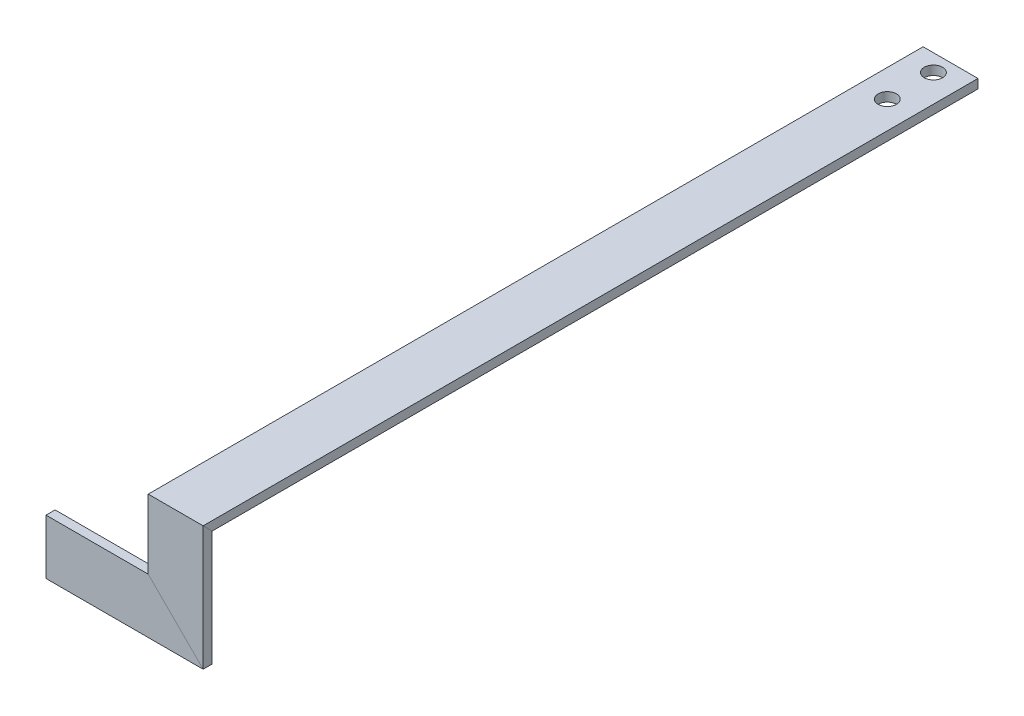
ISO-10303-21;
HEADER;
FILE_DESCRIPTION(('STEP AP214'),'2;1');
FILE_NAME('part.step','',(''),(''),'','','');
FILE_SCHEMA(('AUTOMOTIVE_DESIGN { 1 0 10303 214 1 1 1 1 }'));
ENDSEC;
DATA;
#1=APPLICATION_CONTEXT('core data for automotive mechanical design processes');
#2=APPLICATION_PROTOCOL_DEFINITION('international standard','automotive_design',2000,#1);
#3=PRODUCT_CONTEXT('',#1,'mechanical');
#4=PRODUCT('Part','Part','',(#3));
#5=PRODUCT_RELATED_PRODUCT_CATEGORY('part','',(#4));
#6=PRODUCT_DEFINITION_FORMATION('','',#4);
#7=PRODUCT_DEFINITION_CONTEXT('part definition',#1,'design');
#8=PRODUCT_DEFINITION('design','',#6,#7);
#9=PRODUCT_DEFINITION_SHAPE('','',#8);
#10=(LENGTH_UNIT() NAMED_UNIT(*) SI_UNIT(.MILLI.,.METRE.));
#11=(NAMED_UNIT(*) PLANE_ANGLE_UNIT() SI_UNIT($,.RADIAN.));
#12=(NAMED_UNIT(*) SI_UNIT($,.STERADIAN.) SOLID_ANGLE_UNIT());
#13=UNCERTAINTY_MEASURE_WITH_UNIT(LENGTH_MEASURE(1.E-05),#10,'distance_accuracy_value','');
#14=(GEOMETRIC_REPRESENTATION_CONTEXT(3) GLOBAL_UNCERTAINTY_ASSIGNED_CONTEXT((#13)) GLOBAL_UNIT_ASSIGNED_CONTEXT((#10,
#11,#12)) REPRESENTATION_CONTEXT('',''));
#15=CARTESIAN_POINT('',(0.,0.,0.));
#16=DIRECTION('',(0.,0.,1.));
#17=DIRECTION('',(1.,0.,0.));
#18=AXIS2_PLACEMENT_3D('',#15,#16,#17);
#19=CARTESIAN_POINT('',(-90.,-64.,534.55));
#20=DIRECTION('',(-1.,0.,0.));
#21=DIRECTION('',(0.,-1.,0.));
#22=AXIS2_PLACEMENT_3D('',#19,#20,#21);
#23=PLANE('',#22);
#24=DIRECTION('',(0.,0.,1.));
#25=VECTOR('',#24,1.);
#26=CARTESIAN_POINT('',(-90.,-83.05,537.705));
#27=LINE('',#26,#25);
#28=CARTESIAN_POINT('',(-90.,-83.05,531.395));
#29=VERTEX_POINT('',#28);
#30=CARTESIAN_POINT('',(-90.,-83.05,537.705));
#31=VERTEX_POINT('',#30);
#32=EDGE_CURVE('E86',#29,#31,#27,.T.);
#33=ORIENTED_EDGE('',*,*,#32,.T.);
#34=DIRECTION('',(0.,1.,0.));
#35=VECTOR('',#34,1.);
#36=CARTESIAN_POINT('',(-90.,-44.95,537.705));
#37=LINE('',#36,#35);
#38=CARTESIAN_POINT('',(-90.,-44.95,537.705));
#39=VERTEX_POINT('',#38);
#40=EDGE_CURVE('E84',#31,#39,#37,.T.);
#41=ORIENTED_EDGE('',*,*,#40,.T.);
#42=DIRECTION('',(0.,0.,-1.));
#43=VECTOR('',#42,1.);
#44=CARTESIAN_POINT('',(-90.,-44.95,537.705));
#45=LINE('',#44,#43);
#46=CARTESIAN_POINT('',(-90.,-44.95,531.395));
#47=VERTEX_POINT('',#46);
#48=EDGE_CURVE('E81',#39,#47,#45,.T.);
#49=ORIENTED_EDGE('',*,*,#48,.T.);
#50=DIRECTION('',(0.,-1.,0.));
#51=VECTOR('',#50,1.);
#52=CARTESIAN_POINT('',(-90.,-44.95,531.395));
#53=LINE('',#52,#51);
#54=EDGE_CURVE('E101',#47,#29,#53,.T.);
#55=ORIENTED_EDGE('',*,*,#54,.T.);
#56=EDGE_LOOP('',(#33,#41,#49,#55));
#57=FACE_BOUND('',#56,.T.);
#58=ADVANCED_FACE('F35',(#57),#23,.T.);
#59=CARTESIAN_POINT('',(0.,0.,0.));
#60=DIRECTION('',(0.,0.,1.));
#61=DIRECTION('',(1.,0.,0.));
#62=AXIS2_PLACEMENT_3D('',#59,#60,#61);
#63=PLANE('',#62);
#64=DIRECTION('',(0.,1.,0.));
#65=VECTOR('',#64,1.);
#66=CARTESIAN_POINT('',(19.05,3.155,0.));
#67=LINE('',#66,#65);
#68=CARTESIAN_POINT('',(19.05,-3.155,0.));
#69=VERTEX_POINT('',#68);
#70=CARTESIAN_POINT('',(19.05,3.155,0.));
#71=VERTEX_POINT('',#70);
#72=EDGE_CURVE('E143',#69,#71,#67,.T.);
#73=ORIENTED_EDGE('',*,*,#72,.F.);
#74=DIRECTION('',(1.,0.,0.));
#75=VECTOR('',#74,1.);
#76=CARTESIAN_POINT('',(-19.05,-3.155,0.));
#77=LINE('',#76,#75);
#78=CARTESIAN_POINT('',(-19.05,-3.155,0.));
#79=VERTEX_POINT('',#78);
#80=EDGE_CURVE('E149',#79,#69,#77,.T.);
#81=ORIENTED_EDGE('',*,*,#80,.F.);
#82=DIRECTION('',(0.,-1.,0.));
#83=VECTOR('',#82,1.);
#84=CARTESIAN_POINT('',(-19.05,3.155,0.));
#85=LINE('',#84,#83);
#86=CARTESIAN_POINT('',(-19.05,3.155,0.));
#87=VERTEX_POINT('',#86);
#88=EDGE_CURVE('E133',#87,#79,#85,.T.);
#89=ORIENTED_EDGE('',*,*,#88,.F.);
#90=DIRECTION('',(-1.,0.,0.));
#91=VECTOR('',#90,1.);
#92=CARTESIAN_POINT('',(-19.05,3.155,0.));
#93=LINE('',#92,#91);
#94=EDGE_CURVE('E139',#71,#87,#93,.T.);
#95=ORIENTED_EDGE('',*,*,#94,.F.);
#96=EDGE_LOOP('',(#73,#81,#89,#95));
#97=FACE_BOUND('',#96,.T.);
#98=ADVANCED_FACE('F336',(#97),#63,.F.);
#99=CARTESIAN_POINT('',(21.055,-44.95,537.705));
#100=DIRECTION('',(0.,1.,0.));
#101=DIRECTION('',(0.,0.,1.));
#102=AXIS2_PLACEMENT_3D('',#99,#100,#101);
#103=PLANE('',#102);
#104=DIRECTION('',(0.,0.,1.));
#105=VECTOR('',#104,1.);
#106=CARTESIAN_POINT('',(-19.05,-44.95,537.705));
#107=LINE('',#106,#105);
#108=CARTESIAN_POINT('',(-19.05,-44.95,531.395));
#109=VERTEX_POINT('',#108);
#110=CARTESIAN_POINT('',(-19.05,-44.95,537.705));
#111=VERTEX_POINT('',#110);
#112=EDGE_CURVE('E117',#109,#111,#107,.T.);
#113=ORIENTED_EDGE('',*,*,#112,.F.);
#114=DIRECTION('',(-1.,0.,0.));
#115=VECTOR('',#114,1.);
#116=CARTESIAN_POINT('',(21.055,-44.95,531.395));
#117=LINE('',#116,#115);
#118=EDGE_CURVE('E99',#109,#47,#117,.T.);
#119=ORIENTED_EDGE('',*,*,#118,.T.);
#120=ORIENTED_EDGE('',*,*,#48,.F.);
#121=DIRECTION('',(-1.,0.,0.));
#122=VECTOR('',#121,1.);
#123=CARTESIAN_POINT('',(21.055,-44.95,537.705));
#124=LINE('',#123,#122);
#125=EDGE_CURVE('E38',#111,#39,#124,.T.);
#126=ORIENTED_EDGE('',*,*,#125,.F.);
#127=EDGE_LOOP('',(#113,#119,#120,#126));
#128=FACE_BOUND('',#127,.T.);
#129=ADVANCED_FACE('F96',(#128),#103,.T.);
#130=CARTESIAN_POINT('',(21.055,-44.95,531.395));
#131=DIRECTION('',(0.,0.,-1.));
#132=DIRECTION('',(-1.,0.,0.));
#133=AXIS2_PLACEMENT_3D('',#130,#131,#132);
#134=PLANE('',#133);
#135=DIRECTION('',(-0.707106781186548,0.707106781186548,0.));
#136=VECTOR('',#135,1.);
#137=CARTESIAN_POINT('',(-43.3102499999999,-20.68975,531.395));
#138=LINE('',#137,#136);
#139=CARTESIAN_POINT('',(19.05,-83.05,531.395));
#140=VERTEX_POINT('',#139);
#141=EDGE_CURVE('E130',#140,#109,#138,.T.);
#142=ORIENTED_EDGE('',*,*,#141,.F.);
#143=DIRECTION('',(-1.,0.,0.));
#144=VECTOR('',#143,1.);
#145=CARTESIAN_POINT('',(21.055,-83.05,531.395));
#146=LINE('',#145,#144);
#147=EDGE_CURVE('E110',#140,#29,#146,.T.);
#148=ORIENTED_EDGE('',*,*,#147,.T.);
#149=ORIENTED_EDGE('',*,*,#54,.F.);
#150=ORIENTED_EDGE('',*,*,#118,.F.);
#151=EDGE_LOOP('',(#142,#148,#149,#150));
#152=FACE_BOUND('',#151,.T.);
#153=ADVANCED_FACE('F319',(#152),#134,.T.);
#154=CARTESIAN_POINT('',(21.055,-83.05,537.705));
#155=DIRECTION('',(0.,-1.,0.));
#156=DIRECTION('',(0.,0.,-1.));
#157=AXIS2_PLACEMENT_3D('',#154,#155,#156);
#158=PLANE('',#157);
#159=DIRECTION('',(0.,0.,-1.));
#160=VECTOR('',#159,1.);
#161=CARTESIAN_POINT('',(19.05,-83.05,537.705));
#162=LINE('',#161,#160);
#163=CARTESIAN_POINT('',(19.05,-83.05,537.705));
#164=VERTEX_POINT('',#163);
#165=EDGE_CURVE('E127',#164,#140,#162,.T.);
#166=ORIENTED_EDGE('',*,*,#165,.F.);
#167=DIRECTION('',(-1.,0.,0.));
#168=VECTOR('',#167,1.);
#169=CARTESIAN_POINT('',(21.055,-83.05,537.705));
#170=LINE('',#169,#168);
#171=EDGE_CURVE('E100',#164,#31,#170,.T.);
#172=ORIENTED_EDGE('',*,*,#171,.T.);
#173=ORIENTED_EDGE('',*,*,#32,.F.);
#174=ORIENTED_EDGE('',*,*,#147,.F.);
#175=EDGE_LOOP('',(#166,#172,#173,#174));
#176=FACE_BOUND('',#175,.T.);
#177=ADVANCED_FACE('F234',(#176),#158,.T.);
#178=CARTESIAN_POINT('',(21.055,-44.95,537.705));
#179=DIRECTION('',(0.,0.,1.));
#180=DIRECTION('',(1.,0.,0.));
#181=AXIS2_PLACEMENT_3D('',#178,#179,#180);
#182=PLANE('',#181);
#183=DIRECTION('',(0.707106781186548,-0.707106781186548,0.));
#184=VECTOR('',#183,1.);
#185=CARTESIAN_POINT('',(-43.3102499999999,-20.68975,537.705));
#186=LINE('',#185,#184);
#187=EDGE_CURVE('E105',#111,#164,#186,.T.);
#188=ORIENTED_EDGE('',*,*,#187,.F.);
#189=ORIENTED_EDGE('',*,*,#125,.T.);
#190=ORIENTED_EDGE('',*,*,#40,.F.);
#191=ORIENTED_EDGE('',*,*,#171,.F.);
#192=EDGE_LOOP('',(#188,#189,#190,#191));
#193=FACE_BOUND('',#192,.T.);
#194=ADVANCED_FACE('F103',(#193),#182,.T.);
#195=CARTESIAN_POINT('',(-19.05,3.5704999999999,537.705));
#196=DIRECTION('',(0.,0.,1.));
#197=DIRECTION('',(1.,0.,0.));
#198=AXIS2_PLACEMENT_3D('',#195,#196,#197);
#199=PLANE('',#198);
#200=DIRECTION('',(0.,-1.,0.));
#201=VECTOR('',#200,1.);
#202=CARTESIAN_POINT('',(-19.05,3.5704999999999,537.705));
#203=LINE('',#202,#201);
#204=CARTESIAN_POINT('',(-19.05,3.15499999999998,537.705));
#205=VERTEX_POINT('',#204);
#206=EDGE_CURVE('E119',#205,#111,#203,.T.);
#207=ORIENTED_EDGE('',*,*,#206,.T.);
#208=ORIENTED_EDGE('',*,*,#187,.T.);
#209=DIRECTION('',(0.,-1.,0.));
#210=VECTOR('',#209,1.);
#211=CARTESIAN_POINT('',(19.05,3.5704999999999,537.705));
#212=LINE('',#211,#210);
#213=CARTESIAN_POINT('',(19.05,3.15499999999998,537.705));
#214=VERTEX_POINT('',#213);
#215=EDGE_CURVE('E106',#214,#164,#212,.T.);
#216=ORIENTED_EDGE('',*,*,#215,.F.);
#217=DIRECTION('',(1.,0.,0.));
#218=VECTOR('',#217,1.);
#219=CARTESIAN_POINT('',(-19.05,3.155,537.705));
#220=LINE('',#219,#218);
#221=EDGE_CURVE('E137',#205,#214,#220,.T.);
#222=ORIENTED_EDGE('',*,*,#221,.F.);
#223=EDGE_LOOP('',(#207,#208,#216,#222));
#224=FACE_BOUND('',#223,.T.);
#225=ADVANCED_FACE('F226',(#224),#199,.T.);
#226=CARTESIAN_POINT('',(19.05,3.5704999999999,537.705));
#227=DIRECTION('',(1.,0.,0.));
#228=DIRECTION('',(0.,0.,-1.));
#229=AXIS2_PLACEMENT_3D('',#226,#227,#228);
#230=PLANE('',#229);
#231=ORIENTED_EDGE('',*,*,#215,.T.);
#232=ORIENTED_EDGE('',*,*,#165,.T.);
#233=DIRECTION('',(0.,-1.,0.));
#234=VECTOR('',#233,1.);
#235=CARTESIAN_POINT('',(19.05,3.5704999999999,531.395));
#236=LINE('',#235,#234);
#237=CARTESIAN_POINT('',(19.05,-3.15500000000006,531.395));
#238=VERTEX_POINT('',#237);
#239=EDGE_CURVE('E108',#238,#140,#236,.T.);
#240=ORIENTED_EDGE('',*,*,#239,.F.);
#241=DIRECTION('',(0.,-0.707106781186548,-0.707106781186548));
#242=VECTOR('',#241,1.);
#243=CARTESIAN_POINT('',(19.05,-265.6975,268.8525));
#244=LINE('',#243,#242);
#245=EDGE_CURVE('E44',#214,#238,#244,.T.);
#246=ORIENTED_EDGE('',*,*,#245,.F.);
#247=EDGE_LOOP('',(#231,#232,#240,#246));
#248=FACE_BOUND('',#247,.T.);
#249=ADVANCED_FACE('F224',(#248),#230,.T.);
#250=CARTESIAN_POINT('',(-19.05,3.5704999999999,531.395));
#251=DIRECTION('',(0.,0.,-1.));
#252=DIRECTION('',(-1.,0.,0.));
#253=AXIS2_PLACEMENT_3D('',#250,#251,#252);
#254=PLANE('',#253);
#255=ORIENTED_EDGE('',*,*,#239,.T.);
#256=ORIENTED_EDGE('',*,*,#141,.T.);
#257=DIRECTION('',(0.,-1.,0.));
#258=VECTOR('',#257,1.);
#259=CARTESIAN_POINT('',(-19.05,3.5704999999999,531.395));
#260=LINE('',#259,#258);
#261=CARTESIAN_POINT('',(-19.05,-3.15500000000006,531.395));
#262=VERTEX_POINT('',#261);
#263=EDGE_CURVE('E122',#262,#109,#260,.T.);
#264=ORIENTED_EDGE('',*,*,#263,.F.);
#265=DIRECTION('',(-1.,0.,0.));
#266=VECTOR('',#265,1.);
#267=CARTESIAN_POINT('',(-19.05,-3.155,531.395));
#268=LINE('',#267,#266);
#269=EDGE_CURVE('E11',#238,#262,#268,.T.);
#270=ORIENTED_EDGE('',*,*,#269,.F.);
#271=EDGE_LOOP('',(#255,#256,#264,#270));
#272=FACE_BOUND('',#271,.T.);
#273=ADVANCED_FACE('F218',(#272),#254,.T.);
#274=CARTESIAN_POINT('',(-19.05,3.5704999999999,537.705));
#275=DIRECTION('',(-1.,0.,0.));
#276=DIRECTION('',(0.,0.,1.));
#277=AXIS2_PLACEMENT_3D('',#274,#275,#276);
#278=PLANE('',#277);
#279=ORIENTED_EDGE('',*,*,#263,.T.);
#280=ORIENTED_EDGE('',*,*,#112,.T.);
#281=ORIENTED_EDGE('',*,*,#206,.F.);
#282=DIRECTION('',(0.,0.707106781186548,0.707106781186548));
#283=VECTOR('',#282,1.);
#284=CARTESIAN_POINT('',(-19.05,-265.6975,268.8525));
#285=LINE('',#284,#283);
#286=EDGE_CURVE('E134',#262,#205,#285,.T.);
#287=ORIENTED_EDGE('',*,*,#286,.F.);
#288=EDGE_LOOP('',(#279,#280,#281,#287));
#289=FACE_BOUND('',#288,.T.);
#290=ADVANCED_FACE('F191',(#289),#278,.T.);
#291=CARTESIAN_POINT('',(-19.05,3.155,0.));
#292=DIRECTION('',(0.,1.,0.));
#293=DIRECTION('',(0.,0.,1.));
#294=AXIS2_PLACEMENT_3D('',#291,#292,#293);
#295=PLANE('',#294);
#296=CARTESIAN_POINT('',(6.7168492989822E-12,3.155,11.892204665723));
#297=DIRECTION('',(0.,1.,0.));
#298=DIRECTION('',(0.,0.,1.));
#299=AXIS2_PLACEMENT_3D('',#296,#297,#298);
#300=CIRCLE('',#299,6.35000000000002);
#301=CARTESIAN_POINT('',(6.7168492989822E-12,3.155,18.2422046657231));
#302=VERTEX_POINT('',#301);
#303=EDGE_CURVE('E171',#302,#302,#300,.T.);
#304=ORIENTED_EDGE('',*,*,#303,.F.);
#305=EDGE_LOOP('',(#304));
#306=FACE_BOUND('',#305,.T.);
#307=CARTESIAN_POINT('',(6.82787160144471E-12,3.155,43.8922046657231));
#308=DIRECTION('',(0.,1.,0.));
#309=DIRECTION('',(0.,0.,1.));
#310=AXIS2_PLACEMENT_3D('',#307,#308,#309);
#311=CIRCLE('',#310,6.35000000000002);
#312=CARTESIAN_POINT('',(6.82787160144471E-12,3.155,50.2422046657231));
#313=VERTEX_POINT('',#312);
#314=EDGE_CURVE('E165',#313,#313,#311,.T.);
#315=ORIENTED_EDGE('',*,*,#314,.F.);
#316=EDGE_LOOP('',(#315));
#317=FACE_BOUND('',#316,.T.);
#318=DIRECTION('',(0.,0.,1.));
#319=VECTOR('',#318,1.);
#320=CARTESIAN_POINT('',(-19.05,3.155,0.));
#321=LINE('',#320,#319);
#322=EDGE_CURVE('E142',#87,#205,#321,.T.);
#323=ORIENTED_EDGE('',*,*,#322,.T.);
#324=ORIENTED_EDGE('',*,*,#221,.T.);
#325=DIRECTION('',(0.,0.,1.));
#326=VECTOR('',#325,1.);
#327=CARTESIAN_POINT('',(19.05,3.155,0.));
#328=LINE('',#327,#326);
#329=EDGE_CURVE('E138',#71,#214,#328,.T.);
#330=ORIENTED_EDGE('',*,*,#329,.F.);
#331=ORIENTED_EDGE('',*,*,#94,.T.);
#332=EDGE_LOOP('',(#323,#324,#330,#331));
#333=FACE_BOUND('',#332,.T.);
#334=ADVANCED_FACE('F187',(#306,#317,#333),#295,.T.);
#335=CARTESIAN_POINT('',(19.05,3.155,0.));
#336=DIRECTION('',(1.,0.,0.));
#337=DIRECTION('',(0.,0.,-1.));
#338=AXIS2_PLACEMENT_3D('',#335,#336,#337);
#339=PLANE('',#338);
#340=ORIENTED_EDGE('',*,*,#329,.T.);
#341=ORIENTED_EDGE('',*,*,#245,.T.);
#342=DIRECTION('',(0.,0.,1.));
#343=VECTOR('',#342,1.);
#344=CARTESIAN_POINT('',(19.05,-3.155,0.));
#345=LINE('',#344,#343);
#346=EDGE_CURVE('E146',#69,#238,#345,.T.);
#347=ORIENTED_EDGE('',*,*,#346,.F.);
#348=ORIENTED_EDGE('',*,*,#72,.T.);
#349=EDGE_LOOP('',(#340,#341,#347,#348));
#350=FACE_BOUND('',#349,.T.);
#351=ADVANCED_FACE('F190',(#350),#339,.T.);
#352=CARTESIAN_POINT('',(-19.05,-3.155,0.));
#353=DIRECTION('',(0.,-1.,0.));
#354=DIRECTION('',(0.,0.,-1.));
#355=AXIS2_PLACEMENT_3D('',#352,#353,#354);
#356=PLANE('',#355);
#357=CARTESIAN_POINT('',(6.7168492989822E-12,-3.155,11.892204665723));
#358=DIRECTION('',(0.,1.,0.));
#359=DIRECTION('',(0.,0.,1.));
#360=AXIS2_PLACEMENT_3D('',#357,#358,#359);
#361=CIRCLE('',#360,6.35000000000002);
#362=CARTESIAN_POINT('',(6.7168492989822E-12,-3.155,18.2422046657231));
#363=VERTEX_POINT('',#362);
#364=EDGE_CURVE('E168',#363,#363,#361,.T.);
#365=ORIENTED_EDGE('',*,*,#364,.T.);
#366=EDGE_LOOP('',(#365));
#367=FACE_BOUND('',#366,.T.);
#368=CARTESIAN_POINT('',(6.82787160144471E-12,-3.155,43.8922046657231));
#369=DIRECTION('',(0.,1.,0.));
#370=DIRECTION('',(0.,0.,1.));
#371=AXIS2_PLACEMENT_3D('',#368,#369,#370);
#372=CIRCLE('',#371,6.35000000000002);
#373=CARTESIAN_POINT('',(6.82787160144471E-12,-3.155,50.2422046657231));
#374=VERTEX_POINT('',#373);
#375=EDGE_CURVE('E91',#374,#374,#372,.T.);
#376=ORIENTED_EDGE('',*,*,#375,.T.);
#377=EDGE_LOOP('',(#376));
#378=FACE_BOUND('',#377,.T.);
#379=ORIENTED_EDGE('',*,*,#346,.T.);
#380=ORIENTED_EDGE('',*,*,#269,.T.);
#381=DIRECTION('',(0.,0.,1.));
#382=VECTOR('',#381,1.);
#383=CARTESIAN_POINT('',(-19.05,-3.155,0.));
#384=LINE('',#383,#382);
#385=EDGE_CURVE('E152',#79,#262,#384,.T.);
#386=ORIENTED_EDGE('',*,*,#385,.F.);
#387=ORIENTED_EDGE('',*,*,#80,.T.);
#388=EDGE_LOOP('',(#379,#380,#386,#387));
#389=FACE_BOUND('',#388,.T.);
#390=ADVANCED_FACE('F177',(#367,#378,#389),#356,.T.);
#391=CARTESIAN_POINT('',(-19.05,3.155,0.));
#392=DIRECTION('',(-1.,0.,0.));
#393=DIRECTION('',(0.,0.,1.));
#394=AXIS2_PLACEMENT_3D('',#391,#392,#393);
#395=PLANE('',#394);
#396=ORIENTED_EDGE('',*,*,#385,.T.);
#397=ORIENTED_EDGE('',*,*,#286,.T.);
#398=ORIENTED_EDGE('',*,*,#322,.F.);
#399=ORIENTED_EDGE('',*,*,#88,.T.);
#400=EDGE_LOOP('',(#396,#397,#398,#399));
#401=FACE_BOUND('',#400,.T.);
#402=ADVANCED_FACE('F201',(#401),#395,.T.);
#403=CARTESIAN_POINT('',(6.82787160144471E-12,-3.155,43.8922046657231));
#404=DIRECTION('',(0.,1.,0.));
#405=DIRECTION('',(0.,0.,1.));
#406=AXIS2_PLACEMENT_3D('',#403,#404,#405);
#407=CYLINDRICAL_SURFACE('',#406,6.35000000000002);
#408=ORIENTED_EDGE('',*,*,#375,.F.);
#409=EDGE_LOOP('',(#408));
#410=FACE_BOUND('',#409,.T.);
#411=ORIENTED_EDGE('',*,*,#314,.T.);
#412=EDGE_LOOP('',(#411));
#413=FACE_BOUND('',#412,.T.);
#414=ADVANCED_FACE('F183',(#410,#413),#407,.F.);
#415=CARTESIAN_POINT('',(6.7168492989822E-12,-3.155,11.892204665723));
#416=DIRECTION('',(0.,1.,0.));
#417=DIRECTION('',(0.,0.,1.));
#418=AXIS2_PLACEMENT_3D('',#415,#416,#417);
#419=CYLINDRICAL_SURFACE('',#418,6.35000000000002);
#420=ORIENTED_EDGE('',*,*,#364,.F.);
#421=EDGE_LOOP('',(#420));
#422=FACE_BOUND('',#421,.T.);
#423=ORIENTED_EDGE('',*,*,#303,.T.);
#424=EDGE_LOOP('',(#423));
#425=FACE_BOUND('',#424,.T.);
#426=ADVANCED_FACE('F180',(#422,#425),#419,.F.);
#427=CLOSED_SHELL('',(#58,#98,#129,#153,#177,#194,#225,#249,#273,#290,#334,#351,#390,#402,#414,#426));
#428=MANIFOLD_SOLID_BREP('B2',#427);
#429=ADVANCED_BREP_SHAPE_REPRESENTATION('',(#18,#428),#14);
#430=SHAPE_DEFINITION_REPRESENTATION(#9,#429);
ENDSEC;
END-ISO-10303-21;
